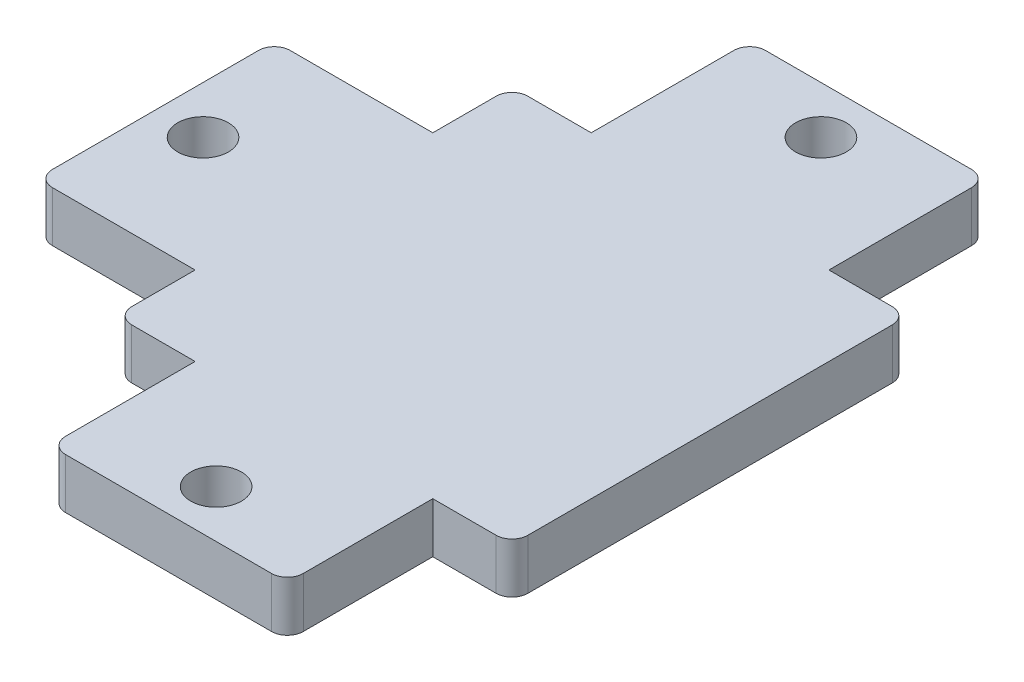
ISO-10303-21;
HEADER;
FILE_DESCRIPTION(('STEP AP214'),'2;1');
FILE_NAME('part.step','',(''),(''),'','','');
FILE_SCHEMA(('AUTOMOTIVE_DESIGN { 1 0 10303 214 1 1 1 1 }'));
ENDSEC;
DATA;
#1=APPLICATION_CONTEXT('core data for automotive mechanical design processes');
#2=APPLICATION_PROTOCOL_DEFINITION('international standard','automotive_design',2000,#1);
#3=PRODUCT_CONTEXT('',#1,'mechanical');
#4=PRODUCT('Part','Part','',(#3));
#5=PRODUCT_RELATED_PRODUCT_CATEGORY('part','',(#4));
#6=PRODUCT_DEFINITION_FORMATION('','',#4);
#7=PRODUCT_DEFINITION_CONTEXT('part definition',#1,'design');
#8=PRODUCT_DEFINITION('design','',#6,#7);
#9=PRODUCT_DEFINITION_SHAPE('','',#8);
#10=(LENGTH_UNIT() NAMED_UNIT(*) SI_UNIT(.MILLI.,.METRE.));
#11=(NAMED_UNIT(*) PLANE_ANGLE_UNIT() SI_UNIT($,.RADIAN.));
#12=(NAMED_UNIT(*) SI_UNIT($,.STERADIAN.) SOLID_ANGLE_UNIT());
#13=UNCERTAINTY_MEASURE_WITH_UNIT(LENGTH_MEASURE(1.E-05),#10,'distance_accuracy_value','');
#14=(GEOMETRIC_REPRESENTATION_CONTEXT(3) GLOBAL_UNCERTAINTY_ASSIGNED_CONTEXT((#13)) GLOBAL_UNIT_ASSIGNED_CONTEXT((#10,
#11,#12)) REPRESENTATION_CONTEXT('',''));
#15=CARTESIAN_POINT('',(0.,0.,0.));
#16=DIRECTION('',(0.,0.,1.));
#17=DIRECTION('',(1.,0.,0.));
#18=AXIS2_PLACEMENT_3D('',#15,#16,#17);
#19=CARTESIAN_POINT('',(-10.,-6.825,15.));
#20=DIRECTION('',(0.,0.,-1.));
#21=DIRECTION('',(-1.,0.,0.));
#22=AXIS2_PLACEMENT_3D('',#19,#20,#21);
#23=PLANE('',#22);
#24=DIRECTION('',(-1.,0.,0.));
#25=VECTOR('',#24,1.);
#26=CARTESIAN_POINT('',(-10.,3.175,15.));
#27=LINE('',#26,#25);
#28=CARTESIAN_POINT('',(-4.99999999999999,3.175,15.));
#29=VERTEX_POINT('',#28);
#30=CARTESIAN_POINT('',(-9.,3.175,15.));
#31=VERTEX_POINT('',#30);
#32=EDGE_CURVE('E330',#29,#31,#27,.T.);
#33=ORIENTED_EDGE('',*,*,#32,.T.);
#34=DIRECTION('',(0.,1.,0.));
#35=VECTOR('',#34,1.);
#36=CARTESIAN_POINT('',(-9.,-6.825,15.));
#37=LINE('',#36,#35);
#38=CARTESIAN_POINT('',(-9.,0.,15.));
#39=VERTEX_POINT('',#38);
#40=EDGE_CURVE('E408',#31,#39,#37,.F.);
#41=ORIENTED_EDGE('',*,*,#40,.T.);
#42=DIRECTION('',(1.,0.,0.));
#43=VECTOR('',#42,1.);
#44=CARTESIAN_POINT('',(0.,0.,15.));
#45=LINE('',#44,#43);
#46=CARTESIAN_POINT('',(-4.99999999999999,0.,15.));
#47=VERTEX_POINT('',#46);
#48=EDGE_CURVE('E474',#39,#47,#45,.T.);
#49=ORIENTED_EDGE('',*,*,#48,.T.);
#50=DIRECTION('',(0.,1.,0.));
#51=VECTOR('',#50,1.);
#52=CARTESIAN_POINT('',(-4.99999999999999,-6.825,15.));
#53=LINE('',#52,#51);
#54=EDGE_CURVE('E335',#47,#29,#53,.T.);
#55=ORIENTED_EDGE('',*,*,#54,.T.);
#56=EDGE_LOOP('',(#33,#41,#49,#55));
#57=FACE_BOUND('',#56,.T.);
#58=ADVANCED_FACE('F130',(#57),#23,.F.);
#59=CARTESIAN_POINT('',(-20.,3.175,-20.));
#60=DIRECTION('',(1.,0.,0.));
#61=DIRECTION('',(0.,0.,-1.));
#62=AXIS2_PLACEMENT_3D('',#59,#60,#61);
#63=PLANE('',#62);
#64=DIRECTION('',(0.,0.,1.));
#65=VECTOR('',#64,1.);
#66=CARTESIAN_POINT('',(-20.,0.,-20.));
#67=LINE('',#66,#65);
#68=CARTESIAN_POINT('',(-20.,0.,-4.));
#69=VERTEX_POINT('',#68);
#70=CARTESIAN_POINT('',(-20.,0.,9.00000000000001));
#71=VERTEX_POINT('',#70);
#72=EDGE_CURVE('E462',#69,#71,#67,.T.);
#73=ORIENTED_EDGE('',*,*,#72,.T.);
#74=DIRECTION('',(0.,1.,0.));
#75=VECTOR('',#74,1.);
#76=CARTESIAN_POINT('',(-20.,3.175,9.00000000000001));
#77=LINE('',#76,#75);
#78=CARTESIAN_POINT('',(-20.,3.175,9.00000000000001));
#79=VERTEX_POINT('',#78);
#80=EDGE_CURVE('E412',#71,#79,#77,.T.);
#81=ORIENTED_EDGE('',*,*,#80,.T.);
#82=DIRECTION('',(0.,0.,1.));
#83=VECTOR('',#82,1.);
#84=CARTESIAN_POINT('',(-20.,3.175,-20.));
#85=LINE('',#84,#83);
#86=CARTESIAN_POINT('',(-20.,3.175,-4.));
#87=VERTEX_POINT('',#86);
#88=EDGE_CURVE('E455',#87,#79,#85,.T.);
#89=ORIENTED_EDGE('',*,*,#88,.F.);
#90=DIRECTION('',(0.,1.,0.));
#91=VECTOR('',#90,1.);
#92=CARTESIAN_POINT('',(-20.,3.175,-4.));
#93=LINE('',#92,#91);
#94=EDGE_CURVE('E410',#87,#69,#93,.F.);
#95=ORIENTED_EDGE('',*,*,#94,.T.);
#96=EDGE_LOOP('',(#73,#81,#89,#95));
#97=FACE_BOUND('',#96,.T.);
#98=ADVANCED_FACE('F556',(#97),#63,.F.);
#99=CARTESIAN_POINT('',(20.,3.175,-20.));
#100=DIRECTION('',(0.,0.,1.));
#101=DIRECTION('',(1.,0.,0.));
#102=AXIS2_PLACEMENT_3D('',#99,#100,#101);
#103=PLANE('',#102);
#104=DIRECTION('',(-1.,0.,0.));
#105=VECTOR('',#104,1.);
#106=CARTESIAN_POINT('',(20.,0.,-20.));
#107=LINE('',#106,#105);
#108=CARTESIAN_POINT('',(9.00000000000001,0.,-20.));
#109=VERTEX_POINT('',#108);
#110=CARTESIAN_POINT('',(-4.,0.,-20.));
#111=VERTEX_POINT('',#110);
#112=EDGE_CURVE('E453',#109,#111,#107,.T.);
#113=ORIENTED_EDGE('',*,*,#112,.T.);
#114=DIRECTION('',(0.,1.,0.));
#115=VECTOR('',#114,1.);
#116=CARTESIAN_POINT('',(-4.,3.175,-20.));
#117=LINE('',#116,#115);
#118=CARTESIAN_POINT('',(-4.,3.175,-20.));
#119=VERTEX_POINT('',#118);
#120=EDGE_CURVE('E422',#111,#119,#117,.T.);
#121=ORIENTED_EDGE('',*,*,#120,.T.);
#122=DIRECTION('',(-1.,0.,0.));
#123=VECTOR('',#122,1.);
#124=CARTESIAN_POINT('',(20.,3.175,-20.));
#125=LINE('',#124,#123);
#126=CARTESIAN_POINT('',(9.00000000000001,3.175,-20.));
#127=VERTEX_POINT('',#126);
#128=EDGE_CURVE('E451',#127,#119,#125,.T.);
#129=ORIENTED_EDGE('',*,*,#128,.F.);
#130=DIRECTION('',(0.,1.,0.));
#131=VECTOR('',#130,1.);
#132=CARTESIAN_POINT('',(9.00000000000001,3.175,-20.));
#133=LINE('',#132,#131);
#134=EDGE_CURVE('E420',#127,#109,#133,.F.);
#135=ORIENTED_EDGE('',*,*,#134,.T.);
#136=EDGE_LOOP('',(#113,#121,#129,#135));
#137=FACE_BOUND('',#136,.T.);
#138=ADVANCED_FACE('F450',(#137),#103,.F.);
#139=CARTESIAN_POINT('',(0.,3.175,0.));
#140=DIRECTION('',(0.,-1.,0.));
#141=DIRECTION('',(0.,0.,-1.));
#142=AXIS2_PLACEMENT_3D('',#139,#140,#141);
#143=PLANE('',#142);
#144=CARTESIAN_POINT('',(2.50000000000001,3.175,21.175));
#145=DIRECTION('',(0.,1.,0.));
#146=DIRECTION('',(0.,0.,1.));
#147=AXIS2_PLACEMENT_3D('',#144,#145,#146);
#148=CIRCLE('',#147,1.6);
#149=CARTESIAN_POINT('',(2.50000000000001,3.175,22.775));
#150=VERTEX_POINT('',#149);
#151=EDGE_CURVE('E626',#150,#150,#148,.T.);
#152=ORIENTED_EDGE('',*,*,#151,.F.);
#153=EDGE_LOOP('',(#152));
#154=FACE_BOUND('',#153,.T.);
#155=DIRECTION('',(0.,0.,1.));
#156=VECTOR('',#155,1.);
#157=CARTESIAN_POINT('',(-5.,3.175,-10.));
#158=LINE('',#157,#156);
#159=CARTESIAN_POINT('',(-4.99999999999999,3.175,23.175));
#160=VERTEX_POINT('',#159);
#161=EDGE_CURVE('E317',#29,#160,#158,.T.);
#162=ORIENTED_EDGE('',*,*,#161,.T.);
#163=CARTESIAN_POINT('',(-3.99999999999999,3.175,23.175));
#164=DIRECTION('',(0.,-1.,0.));
#165=DIRECTION('',(0.,0.,-1.));
#166=AXIS2_PLACEMENT_3D('',#163,#164,#165);
#167=CIRCLE('',#166,1.);
#168=CARTESIAN_POINT('',(-3.99999999999999,3.175,24.175));
#169=VERTEX_POINT('',#168);
#170=EDGE_CURVE('E365',#160,#169,#167,.F.);
#171=ORIENTED_EDGE('',*,*,#170,.T.);
#172=DIRECTION('',(1.,0.,0.));
#173=VECTOR('',#172,1.);
#174=CARTESIAN_POINT('',(10.,3.175,24.175));
#175=LINE('',#174,#173);
#176=CARTESIAN_POINT('',(9.00000000000001,3.175,24.175));
#177=VERTEX_POINT('',#176);
#178=EDGE_CURVE('E633',#169,#177,#175,.T.);
#179=ORIENTED_EDGE('',*,*,#178,.T.);
#180=CARTESIAN_POINT('',(9.00000000000001,3.175,23.175));
#181=DIRECTION('',(0.,-1.,0.));
#182=DIRECTION('',(0.,0.,-1.));
#183=AXIS2_PLACEMENT_3D('',#180,#181,#182);
#184=CIRCLE('',#183,1.);
#185=CARTESIAN_POINT('',(10.,3.175,23.175));
#186=VERTEX_POINT('',#185);
#187=EDGE_CURVE('E313',#177,#186,#184,.F.);
#188=ORIENTED_EDGE('',*,*,#187,.T.);
#189=DIRECTION('',(0.,0.,-1.));
#190=VECTOR('',#189,1.);
#191=CARTESIAN_POINT('',(10.,3.175,-10.));
#192=LINE('',#191,#190);
#193=CARTESIAN_POINT('',(10.,3.175,15.));
#194=VERTEX_POINT('',#193);
#195=EDGE_CURVE('E306',#186,#194,#192,.T.);
#196=ORIENTED_EDGE('',*,*,#195,.T.);
#197=CARTESIAN_POINT('',(14.,3.175,15.));
#198=VERTEX_POINT('',#197);
#199=EDGE_CURVE('E311',#198,#194,#27,.T.);
#200=ORIENTED_EDGE('',*,*,#199,.F.);
#201=CARTESIAN_POINT('',(14.,3.175,14.));
#202=DIRECTION('',(0.,-1.,0.));
#203=DIRECTION('',(0.,0.,-1.));
#204=AXIS2_PLACEMENT_3D('',#201,#202,#203);
#205=CIRCLE('',#204,1.);
#206=CARTESIAN_POINT('',(15.,3.175,14.));
#207=VERTEX_POINT('',#206);
#208=EDGE_CURVE('E362',#198,#207,#205,.F.);
#209=ORIENTED_EDGE('',*,*,#208,.T.);
#210=DIRECTION('',(0.,0.,1.));
#211=VECTOR('',#210,1.);
#212=CARTESIAN_POINT('',(15.,3.175,-10.));
#213=LINE('',#212,#211);
#214=CARTESIAN_POINT('',(15.,3.175,-9.));
#215=VERTEX_POINT('',#214);
#216=EDGE_CURVE('E615',#215,#207,#213,.T.);
#217=ORIENTED_EDGE('',*,*,#216,.F.);
#218=CARTESIAN_POINT('',(14.,3.175,-9.));
#219=DIRECTION('',(0.,-1.,0.));
#220=DIRECTION('',(0.,0.,-1.));
#221=AXIS2_PLACEMENT_3D('',#218,#219,#220);
#222=CIRCLE('',#221,1.);
#223=CARTESIAN_POINT('',(14.,3.175,-10.));
#224=VERTEX_POINT('',#223);
#225=EDGE_CURVE('E360',#215,#224,#222,.F.);
#226=ORIENTED_EDGE('',*,*,#225,.T.);
#227=DIRECTION('',(1.,0.,0.));
#228=VECTOR('',#227,1.);
#229=CARTESIAN_POINT('',(20.,3.175,-10.));
#230=LINE('',#229,#228);
#231=CARTESIAN_POINT('',(10.,3.175,-10.));
#232=VERTEX_POINT('',#231);
#233=EDGE_CURVE('E524',#232,#224,#230,.T.);
#234=ORIENTED_EDGE('',*,*,#233,.F.);
#235=DIRECTION('',(0.,0.,1.));
#236=VECTOR('',#235,1.);
#237=CARTESIAN_POINT('',(10.,3.175,-10.));
#238=LINE('',#237,#236);
#239=CARTESIAN_POINT('',(10.,3.175,-19.));
#240=VERTEX_POINT('',#239);
#241=EDGE_CURVE('E520',#240,#232,#238,.T.);
#242=ORIENTED_EDGE('',*,*,#241,.F.);
#243=CARTESIAN_POINT('',(9.00000000000001,3.175,-19.));
#244=DIRECTION('',(0.,-1.,0.));
#245=DIRECTION('',(0.,0.,-1.));
#246=AXIS2_PLACEMENT_3D('',#243,#244,#245);
#247=CIRCLE('',#246,1.);
#248=EDGE_CURVE('E348',#240,#127,#247,.F.);
#249=ORIENTED_EDGE('',*,*,#248,.T.);
#250=ORIENTED_EDGE('',*,*,#128,.T.);
#251=CARTESIAN_POINT('',(-4.,3.175,-19.));
#252=DIRECTION('',(0.,-1.,0.));
#253=DIRECTION('',(0.,0.,-1.));
#254=AXIS2_PLACEMENT_3D('',#251,#252,#253);
#255=CIRCLE('',#254,1.);
#256=CARTESIAN_POINT('',(-5.,3.175,-19.));
#257=VERTEX_POINT('',#256);
#258=EDGE_CURVE('E350',#119,#257,#255,.F.);
#259=ORIENTED_EDGE('',*,*,#258,.T.);
#260=DIRECTION('',(0.,0.,-1.));
#261=VECTOR('',#260,1.);
#262=CARTESIAN_POINT('',(-5.,3.175,-10.));
#263=LINE('',#262,#261);
#264=CARTESIAN_POINT('',(-5.,3.175,-10.));
#265=VERTEX_POINT('',#264);
#266=EDGE_CURVE('E433',#265,#257,#263,.T.);
#267=ORIENTED_EDGE('',*,*,#266,.F.);
#268=DIRECTION('',(1.,0.,0.));
#269=VECTOR('',#268,1.);
#270=CARTESIAN_POINT('',(-20.,3.175,-10.));
#271=LINE('',#270,#269);
#272=CARTESIAN_POINT('',(-9.,3.175,-10.));
#273=VERTEX_POINT('',#272);
#274=EDGE_CURVE('E529',#273,#265,#271,.T.);
#275=ORIENTED_EDGE('',*,*,#274,.F.);
#276=CARTESIAN_POINT('',(-9.,3.175,-9.00000000000001));
#277=DIRECTION('',(0.,-1.,0.));
#278=DIRECTION('',(0.,0.,-1.));
#279=AXIS2_PLACEMENT_3D('',#276,#277,#278);
#280=CIRCLE('',#279,1.);
#281=CARTESIAN_POINT('',(-10.,3.175,-9.00000000000001));
#282=VERTEX_POINT('',#281);
#283=EDGE_CURVE('E358',#273,#282,#280,.F.);
#284=ORIENTED_EDGE('',*,*,#283,.T.);
#285=DIRECTION('',(0.,0.,-1.));
#286=VECTOR('',#285,1.);
#287=CARTESIAN_POINT('',(-10.,3.175,-10.));
#288=LINE('',#287,#286);
#289=CARTESIAN_POINT('',(-10.,3.175,-5.));
#290=VERTEX_POINT('',#289);
#291=EDGE_CURVE('E506',#290,#282,#288,.T.);
#292=ORIENTED_EDGE('',*,*,#291,.F.);
#293=DIRECTION('',(1.,0.,0.));
#294=VECTOR('',#293,1.);
#295=CARTESIAN_POINT('',(-20.,3.175,-5.));
#296=LINE('',#295,#294);
#297=CARTESIAN_POINT('',(-19.,3.175,-5.));
#298=VERTEX_POINT('',#297);
#299=EDGE_CURVE('E509',#298,#290,#296,.T.);
#300=ORIENTED_EDGE('',*,*,#299,.F.);
#301=CARTESIAN_POINT('',(-19.,3.175,-4.));
#302=DIRECTION('',(0.,-1.,0.));
#303=DIRECTION('',(0.,0.,-1.));
#304=AXIS2_PLACEMENT_3D('',#301,#302,#303);
#305=CIRCLE('',#304,1.);
#306=EDGE_CURVE('E352',#298,#87,#305,.F.);
#307=ORIENTED_EDGE('',*,*,#306,.T.);
#308=ORIENTED_EDGE('',*,*,#88,.T.);
#309=CARTESIAN_POINT('',(-19.,3.175,9.00000000000001));
#310=DIRECTION('',(0.,-1.,0.));
#311=DIRECTION('',(0.,0.,-1.));
#312=AXIS2_PLACEMENT_3D('',#309,#310,#311);
#313=CIRCLE('',#312,1.);
#314=CARTESIAN_POINT('',(-19.,3.175,10.));
#315=VERTEX_POINT('',#314);
#316=EDGE_CURVE('E354',#79,#315,#313,.F.);
#317=ORIENTED_EDGE('',*,*,#316,.T.);
#318=DIRECTION('',(-1.,0.,0.));
#319=VECTOR('',#318,1.);
#320=CARTESIAN_POINT('',(-10.,3.175,10.));
#321=LINE('',#320,#319);
#322=CARTESIAN_POINT('',(-10.,3.175,10.));
#323=VERTEX_POINT('',#322);
#324=EDGE_CURVE('E502',#323,#315,#321,.T.);
#325=ORIENTED_EDGE('',*,*,#324,.F.);
#326=DIRECTION('',(0.,0.,-1.));
#327=VECTOR('',#326,1.);
#328=CARTESIAN_POINT('',(-10.,3.175,15.));
#329=LINE('',#328,#327);
#330=CARTESIAN_POINT('',(-10.,3.175,14.));
#331=VERTEX_POINT('',#330);
#332=EDGE_CURVE('E329',#331,#323,#329,.T.);
#333=ORIENTED_EDGE('',*,*,#332,.F.);
#334=CARTESIAN_POINT('',(-9.,3.175,14.));
#335=DIRECTION('',(0.,-1.,0.));
#336=DIRECTION('',(0.,0.,-1.));
#337=AXIS2_PLACEMENT_3D('',#334,#335,#336);
#338=CIRCLE('',#337,1.);
#339=EDGE_CURVE('E356',#331,#31,#338,.F.);
#340=ORIENTED_EDGE('',*,*,#339,.T.);
#341=ORIENTED_EDGE('',*,*,#32,.F.);
#342=EDGE_LOOP('',(#162,#171,#179,#188,#196,#200,#209,#217,#226,#234,#242,#249,#250,#259,#267,
#275,#284,#292,#300,#307,#308,#317,#325,#333,#340,#341));
#343=FACE_BOUND('',#342,.T.);
#344=CARTESIAN_POINT('',(-17.,3.175,2.5));
#345=DIRECTION('',(0.,1.,0.));
#346=DIRECTION('',(0.,0.,1.));
#347=AXIS2_PLACEMENT_3D('',#344,#345,#346);
#348=CIRCLE('',#347,1.6);
#349=CARTESIAN_POINT('',(-17.,3.175,4.1));
#350=VERTEX_POINT('',#349);
#351=EDGE_CURVE('E497',#350,#350,#348,.T.);
#352=ORIENTED_EDGE('',*,*,#351,.F.);
#353=EDGE_LOOP('',(#352));
#354=FACE_BOUND('',#353,.T.);
#355=CARTESIAN_POINT('',(2.5,3.175,-17.));
#356=DIRECTION('',(0.,1.,0.));
#357=DIRECTION('',(0.,0.,1.));
#358=AXIS2_PLACEMENT_3D('',#355,#356,#357);
#359=CIRCLE('',#358,1.6);
#360=CARTESIAN_POINT('',(2.5,3.175,-15.4));
#361=VERTEX_POINT('',#360);
#362=EDGE_CURVE('E516',#361,#361,#359,.T.);
#363=ORIENTED_EDGE('',*,*,#362,.F.);
#364=EDGE_LOOP('',(#363));
#365=FACE_BOUND('',#364,.T.);
#366=ADVANCED_FACE('F309',(#154,#343,#354,#365),#143,.F.);
#367=CARTESIAN_POINT('',(0.,0.,0.));
#368=DIRECTION('',(0.,-1.,0.));
#369=DIRECTION('',(0.,0.,-1.));
#370=AXIS2_PLACEMENT_3D('',#367,#368,#369);
#371=PLANE('',#370);
#372=DIRECTION('',(1.,0.,0.));
#373=VECTOR('',#372,1.);
#374=CARTESIAN_POINT('',(10.,0.,24.175));
#375=LINE('',#374,#373);
#376=CARTESIAN_POINT('',(-3.99999999999999,0.,24.175));
#377=VERTEX_POINT('',#376);
#378=CARTESIAN_POINT('',(9.00000000000001,0.,24.175));
#379=VERTEX_POINT('',#378);
#380=EDGE_CURVE('E638',#377,#379,#375,.T.);
#381=ORIENTED_EDGE('',*,*,#380,.F.);
#382=CARTESIAN_POINT('',(-3.99999999999999,0.,23.175));
#383=DIRECTION('',(0.,-1.,0.));
#384=DIRECTION('',(0.,0.,-1.));
#385=AXIS2_PLACEMENT_3D('',#382,#383,#384);
#386=CIRCLE('',#385,1.);
#387=CARTESIAN_POINT('',(-4.99999999999999,0.,23.175));
#388=VERTEX_POINT('',#387);
#389=EDGE_CURVE('E389',#377,#388,#386,.T.);
#390=ORIENTED_EDGE('',*,*,#389,.T.);
#391=DIRECTION('',(0.,0.,1.));
#392=VECTOR('',#391,1.);
#393=CARTESIAN_POINT('',(-5.,0.,-10.));
#394=LINE('',#393,#392);
#395=EDGE_CURVE('E635',#47,#388,#394,.T.);
#396=ORIENTED_EDGE('',*,*,#395,.F.);
#397=ORIENTED_EDGE('',*,*,#48,.F.);
#398=CARTESIAN_POINT('',(-9.,0.,14.));
#399=DIRECTION('',(0.,-1.,0.));
#400=DIRECTION('',(0.,0.,-1.));
#401=AXIS2_PLACEMENT_3D('',#398,#399,#400);
#402=CIRCLE('',#401,1.);
#403=CARTESIAN_POINT('',(-10.,0.,14.));
#404=VERTEX_POINT('',#403);
#405=EDGE_CURVE('E379',#39,#404,#402,.T.);
#406=ORIENTED_EDGE('',*,*,#405,.T.);
#407=DIRECTION('',(0.,0.,1.));
#408=VECTOR('',#407,1.);
#409=CARTESIAN_POINT('',(-10.,0.,0.));
#410=LINE('',#409,#408);
#411=CARTESIAN_POINT('',(-10.,0.,10.));
#412=VERTEX_POINT('',#411);
#413=EDGE_CURVE('E341',#412,#404,#410,.T.);
#414=ORIENTED_EDGE('',*,*,#413,.F.);
#415=DIRECTION('',(1.,0.,0.));
#416=VECTOR('',#415,1.);
#417=CARTESIAN_POINT('',(0.,0.,10.));
#418=LINE('',#417,#416);
#419=CARTESIAN_POINT('',(-19.,0.,10.));
#420=VERTEX_POINT('',#419);
#421=EDGE_CURVE('E336',#420,#412,#418,.T.);
#422=ORIENTED_EDGE('',*,*,#421,.F.);
#423=CARTESIAN_POINT('',(-19.,0.,9.00000000000001));
#424=DIRECTION('',(0.,-1.,0.));
#425=DIRECTION('',(0.,0.,-1.));
#426=AXIS2_PLACEMENT_3D('',#423,#424,#425);
#427=CIRCLE('',#426,1.);
#428=EDGE_CURVE('E377',#420,#71,#427,.T.);
#429=ORIENTED_EDGE('',*,*,#428,.T.);
#430=ORIENTED_EDGE('',*,*,#72,.F.);
#431=CARTESIAN_POINT('',(-19.,0.,-4.));
#432=DIRECTION('',(0.,-1.,0.));
#433=DIRECTION('',(0.,0.,-1.));
#434=AXIS2_PLACEMENT_3D('',#431,#432,#433);
#435=CIRCLE('',#434,1.);
#436=CARTESIAN_POINT('',(-19.,0.,-5.));
#437=VERTEX_POINT('',#436);
#438=EDGE_CURVE('E375',#69,#437,#435,.T.);
#439=ORIENTED_EDGE('',*,*,#438,.T.);
#440=DIRECTION('',(-1.,0.,0.));
#441=VECTOR('',#440,1.);
#442=CARTESIAN_POINT('',(0.,0.,-5.));
#443=LINE('',#442,#441);
#444=CARTESIAN_POINT('',(-10.,0.,-5.));
#445=VERTEX_POINT('',#444);
#446=EDGE_CURVE('E470',#445,#437,#443,.T.);
#447=ORIENTED_EDGE('',*,*,#446,.F.);
#448=DIRECTION('',(0.,0.,1.));
#449=VECTOR('',#448,1.);
#450=CARTESIAN_POINT('',(-10.,0.,0.));
#451=LINE('',#450,#449);
#452=CARTESIAN_POINT('',(-10.,0.,-9.00000000000001));
#453=VERTEX_POINT('',#452);
#454=EDGE_CURVE('E514',#453,#445,#451,.T.);
#455=ORIENTED_EDGE('',*,*,#454,.F.);
#456=CARTESIAN_POINT('',(-9.,0.,-9.00000000000001));
#457=DIRECTION('',(0.,-1.,0.));
#458=DIRECTION('',(0.,0.,-1.));
#459=AXIS2_PLACEMENT_3D('',#456,#457,#458);
#460=CIRCLE('',#459,1.);
#461=CARTESIAN_POINT('',(-9.,0.,-10.));
#462=VERTEX_POINT('',#461);
#463=EDGE_CURVE('E381',#453,#462,#460,.T.);
#464=ORIENTED_EDGE('',*,*,#463,.T.);
#465=DIRECTION('',(-1.,0.,0.));
#466=VECTOR('',#465,1.);
#467=CARTESIAN_POINT('',(0.,0.,-10.));
#468=LINE('',#467,#466);
#469=CARTESIAN_POINT('',(-5.,0.,-10.));
#470=VERTEX_POINT('',#469);
#471=EDGE_CURVE('E442',#470,#462,#468,.T.);
#472=ORIENTED_EDGE('',*,*,#471,.F.);
#473=DIRECTION('',(0.,0.,1.));
#474=VECTOR('',#473,1.);
#475=CARTESIAN_POINT('',(-5.,0.,0.));
#476=LINE('',#475,#474);
#477=CARTESIAN_POINT('',(-5.,0.,-19.));
#478=VERTEX_POINT('',#477);
#479=EDGE_CURVE('E430',#478,#470,#476,.T.);
#480=ORIENTED_EDGE('',*,*,#479,.F.);
#481=CARTESIAN_POINT('',(-4.,0.,-19.));
#482=DIRECTION('',(0.,-1.,0.));
#483=DIRECTION('',(0.,0.,-1.));
#484=AXIS2_PLACEMENT_3D('',#481,#482,#483);
#485=CIRCLE('',#484,1.);
#486=EDGE_CURVE('E373',#478,#111,#485,.T.);
#487=ORIENTED_EDGE('',*,*,#486,.T.);
#488=ORIENTED_EDGE('',*,*,#112,.F.);
#489=CARTESIAN_POINT('',(9.00000000000001,0.,-19.));
#490=DIRECTION('',(0.,-1.,0.));
#491=DIRECTION('',(0.,0.,-1.));
#492=AXIS2_PLACEMENT_3D('',#489,#490,#491);
#493=CIRCLE('',#492,1.);
#494=CARTESIAN_POINT('',(10.,0.,-19.));
#495=VERTEX_POINT('',#494);
#496=EDGE_CURVE('E153',#109,#495,#493,.T.);
#497=ORIENTED_EDGE('',*,*,#496,.T.);
#498=DIRECTION('',(0.,0.,-1.));
#499=VECTOR('',#498,1.);
#500=CARTESIAN_POINT('',(10.,0.,0.));
#501=LINE('',#500,#499);
#502=CARTESIAN_POINT('',(10.,0.,-10.));
#503=VERTEX_POINT('',#502);
#504=EDGE_CURVE('E443',#503,#495,#501,.T.);
#505=ORIENTED_EDGE('',*,*,#504,.F.);
#506=DIRECTION('',(-1.,0.,0.));
#507=VECTOR('',#506,1.);
#508=CARTESIAN_POINT('',(0.,0.,-10.));
#509=LINE('',#508,#507);
#510=CARTESIAN_POINT('',(14.,0.,-10.));
#511=VERTEX_POINT('',#510);
#512=EDGE_CURVE('E468',#511,#503,#509,.T.);
#513=ORIENTED_EDGE('',*,*,#512,.F.);
#514=CARTESIAN_POINT('',(14.,0.,-9.));
#515=DIRECTION('',(0.,-1.,0.));
#516=DIRECTION('',(0.,0.,-1.));
#517=AXIS2_PLACEMENT_3D('',#514,#515,#516);
#518=CIRCLE('',#517,1.);
#519=CARTESIAN_POINT('',(15.,0.,-9.));
#520=VERTEX_POINT('',#519);
#521=EDGE_CURVE('E383',#511,#520,#518,.T.);
#522=ORIENTED_EDGE('',*,*,#521,.T.);
#523=DIRECTION('',(0.,0.,-1.));
#524=VECTOR('',#523,1.);
#525=CARTESIAN_POINT('',(15.,0.,0.));
#526=LINE('',#525,#524);
#527=CARTESIAN_POINT('',(15.,0.,14.));
#528=VERTEX_POINT('',#527);
#529=EDGE_CURVE('E620',#528,#520,#526,.T.);
#530=ORIENTED_EDGE('',*,*,#529,.F.);
#531=CARTESIAN_POINT('',(14.,0.,14.));
#532=DIRECTION('',(0.,-1.,0.));
#533=DIRECTION('',(0.,0.,-1.));
#534=AXIS2_PLACEMENT_3D('',#531,#532,#533);
#535=CIRCLE('',#534,1.);
#536=CARTESIAN_POINT('',(14.,0.,15.));
#537=VERTEX_POINT('',#536);
#538=EDGE_CURVE('E385',#528,#537,#535,.T.);
#539=ORIENTED_EDGE('',*,*,#538,.T.);
#540=CARTESIAN_POINT('',(10.,0.,15.));
#541=VERTEX_POINT('',#540);
#542=EDGE_CURVE('E473',#541,#537,#45,.T.);
#543=ORIENTED_EDGE('',*,*,#542,.F.);
#544=DIRECTION('',(0.,0.,-1.));
#545=VECTOR('',#544,1.);
#546=CARTESIAN_POINT('',(10.,0.,-10.));
#547=LINE('',#546,#545);
#548=CARTESIAN_POINT('',(10.,0.,23.175));
#549=VERTEX_POINT('',#548);
#550=EDGE_CURVE('E334',#549,#541,#547,.T.);
#551=ORIENTED_EDGE('',*,*,#550,.F.);
#552=CARTESIAN_POINT('',(9.00000000000001,0.,23.175));
#553=DIRECTION('',(0.,-1.,0.));
#554=DIRECTION('',(0.,0.,-1.));
#555=AXIS2_PLACEMENT_3D('',#552,#553,#554);
#556=CIRCLE('',#555,1.);
#557=EDGE_CURVE('E387',#549,#379,#556,.T.);
#558=ORIENTED_EDGE('',*,*,#557,.T.);
#559=EDGE_LOOP('',(#381,#390,#396,#397,#406,#414,#422,#429,#430,#439,#447,#455,#464,#472,#480,
#487,#488,#497,#505,#513,#522,#530,#539,#543,#551,#558));
#560=FACE_BOUND('',#559,.T.);
#561=CARTESIAN_POINT('',(2.50000000000001,0.,21.175));
#562=DIRECTION('',(0.,1.,0.));
#563=DIRECTION('',(0.,0.,1.));
#564=AXIS2_PLACEMENT_3D('',#561,#562,#563);
#565=CIRCLE('',#564,1.6);
#566=CARTESIAN_POINT('',(2.50000000000001,0.,22.775));
#567=VERTEX_POINT('',#566);
#568=EDGE_CURVE('E318',#567,#567,#565,.T.);
#569=ORIENTED_EDGE('',*,*,#568,.T.);
#570=EDGE_LOOP('',(#569));
#571=FACE_BOUND('',#570,.T.);
#572=CARTESIAN_POINT('',(-17.,0.,2.5));
#573=DIRECTION('',(0.,-1.,0.));
#574=DIRECTION('',(0.,0.,-1.));
#575=AXIS2_PLACEMENT_3D('',#572,#573,#574);
#576=CIRCLE('',#575,1.6);
#577=CARTESIAN_POINT('',(-17.,0.,0.9));
#578=VERTEX_POINT('',#577);
#579=EDGE_CURVE('E344',#578,#578,#576,.T.);
#580=ORIENTED_EDGE('',*,*,#579,.F.);
#581=EDGE_LOOP('',(#580));
#582=FACE_BOUND('',#581,.T.);
#583=CARTESIAN_POINT('',(2.5,0.,-17.));
#584=DIRECTION('',(0.,1.,0.));
#585=DIRECTION('',(0.,0.,1.));
#586=AXIS2_PLACEMENT_3D('',#583,#584,#585);
#587=CIRCLE('',#586,1.6);
#588=CARTESIAN_POINT('',(2.5,0.,-15.4));
#589=VERTEX_POINT('',#588);
#590=EDGE_CURVE('E517',#589,#589,#587,.T.);
#591=ORIENTED_EDGE('',*,*,#590,.T.);
#592=EDGE_LOOP('',(#591));
#593=FACE_BOUND('',#592,.T.);
#594=ADVANCED_FACE('F438',(#560,#571,#582,#593),#371,.T.);
#595=CARTESIAN_POINT('',(-5.,-6.825,-10.));
#596=DIRECTION('',(1.,0.,0.));
#597=DIRECTION('',(0.,0.,-1.));
#598=AXIS2_PLACEMENT_3D('',#595,#596,#597);
#599=PLANE('',#598);
#600=ORIENTED_EDGE('',*,*,#266,.T.);
#601=DIRECTION('',(0.,1.,0.));
#602=VECTOR('',#601,1.);
#603=CARTESIAN_POINT('',(-5.,-6.825,-19.));
#604=LINE('',#603,#602);
#605=EDGE_CURVE('E138',#257,#478,#604,.F.);
#606=ORIENTED_EDGE('',*,*,#605,.T.);
#607=ORIENTED_EDGE('',*,*,#479,.T.);
#608=DIRECTION('',(0.,1.,0.));
#609=VECTOR('',#608,1.);
#610=CARTESIAN_POINT('',(-5.,-6.825,-10.));
#611=LINE('',#610,#609);
#612=EDGE_CURVE('E465',#470,#265,#611,.T.);
#613=ORIENTED_EDGE('',*,*,#612,.T.);
#614=EDGE_LOOP('',(#600,#606,#607,#613));
#615=FACE_BOUND('',#614,.T.);
#616=ADVANCED_FACE('F428',(#615),#599,.F.);
#617=CARTESIAN_POINT('',(-20.,-6.825,-10.));
#618=DIRECTION('',(0.,0.,1.));
#619=DIRECTION('',(1.,0.,0.));
#620=AXIS2_PLACEMENT_3D('',#617,#618,#619);
#621=PLANE('',#620);
#622=ORIENTED_EDGE('',*,*,#471,.T.);
#623=DIRECTION('',(0.,1.,0.));
#624=VECTOR('',#623,1.);
#625=CARTESIAN_POINT('',(-9.,-6.825,-10.));
#626=LINE('',#625,#624);
#627=EDGE_CURVE('E400',#462,#273,#626,.T.);
#628=ORIENTED_EDGE('',*,*,#627,.T.);
#629=ORIENTED_EDGE('',*,*,#274,.T.);
#630=ORIENTED_EDGE('',*,*,#612,.F.);
#631=EDGE_LOOP('',(#622,#628,#629,#630));
#632=FACE_BOUND('',#631,.T.);
#633=ADVANCED_FACE('F534',(#632),#621,.F.);
#634=CARTESIAN_POINT('',(20.,-6.825,-10.));
#635=DIRECTION('',(0.,0.,1.));
#636=DIRECTION('',(1.,0.,0.));
#637=AXIS2_PLACEMENT_3D('',#634,#635,#636);
#638=PLANE('',#637);
#639=ORIENTED_EDGE('',*,*,#233,.T.);
#640=DIRECTION('',(0.,1.,0.));
#641=VECTOR('',#640,1.);
#642=CARTESIAN_POINT('',(14.,-6.825,-10.));
#643=LINE('',#642,#641);
#644=EDGE_CURVE('E145',#224,#511,#643,.F.);
#645=ORIENTED_EDGE('',*,*,#644,.T.);
#646=ORIENTED_EDGE('',*,*,#512,.T.);
#647=DIRECTION('',(0.,1.,0.));
#648=VECTOR('',#647,1.);
#649=CARTESIAN_POINT('',(10.,-6.825,-10.));
#650=LINE('',#649,#648);
#651=EDGE_CURVE('E526',#503,#232,#650,.T.);
#652=ORIENTED_EDGE('',*,*,#651,.T.);
#653=EDGE_LOOP('',(#639,#645,#646,#652));
#654=FACE_BOUND('',#653,.T.);
#655=ADVANCED_FACE('F679',(#654),#638,.F.);
#656=CARTESIAN_POINT('',(10.,-6.825,-10.));
#657=DIRECTION('',(-1.,0.,0.));
#658=DIRECTION('',(0.,0.,1.));
#659=AXIS2_PLACEMENT_3D('',#656,#657,#658);
#660=PLANE('',#659);
#661=ORIENTED_EDGE('',*,*,#504,.T.);
#662=DIRECTION('',(0.,1.,0.));
#663=VECTOR('',#662,1.);
#664=CARTESIAN_POINT('',(10.,-6.825,-19.));
#665=LINE('',#664,#663);
#666=EDGE_CURVE('E14',#495,#240,#665,.T.);
#667=ORIENTED_EDGE('',*,*,#666,.T.);
#668=ORIENTED_EDGE('',*,*,#241,.T.);
#669=ORIENTED_EDGE('',*,*,#651,.F.);
#670=EDGE_LOOP('',(#661,#667,#668,#669));
#671=FACE_BOUND('',#670,.T.);
#672=ADVANCED_FACE('F676',(#671),#660,.F.);
#673=CARTESIAN_POINT('',(2.5,0.,-17.));
#674=DIRECTION('',(0.,1.,0.));
#675=DIRECTION('',(0.,0.,1.));
#676=AXIS2_PLACEMENT_3D('',#673,#674,#675);
#677=CYLINDRICAL_SURFACE('',#676,1.6);
#678=ORIENTED_EDGE('',*,*,#590,.F.);
#679=EDGE_LOOP('',(#678));
#680=FACE_BOUND('',#679,.T.);
#681=ORIENTED_EDGE('',*,*,#362,.T.);
#682=EDGE_LOOP('',(#681));
#683=FACE_BOUND('',#682,.T.);
#684=ADVANCED_FACE('F686',(#680,#683),#677,.F.);
#685=CARTESIAN_POINT('',(-10.,-6.825,-10.));
#686=DIRECTION('',(1.,0.,0.));
#687=DIRECTION('',(0.,0.,-1.));
#688=AXIS2_PLACEMENT_3D('',#685,#686,#687);
#689=PLANE('',#688);
#690=ORIENTED_EDGE('',*,*,#291,.T.);
#691=DIRECTION('',(0.,1.,0.));
#692=VECTOR('',#691,1.);
#693=CARTESIAN_POINT('',(-10.,-6.825,-9.00000000000001));
#694=LINE('',#693,#692);
#695=EDGE_CURVE('E403',#282,#453,#694,.F.);
#696=ORIENTED_EDGE('',*,*,#695,.T.);
#697=ORIENTED_EDGE('',*,*,#454,.T.);
#698=DIRECTION('',(0.,1.,0.));
#699=VECTOR('',#698,1.);
#700=CARTESIAN_POINT('',(-10.,-6.825,-5.));
#701=LINE('',#700,#699);
#702=EDGE_CURVE('E511',#445,#290,#701,.T.);
#703=ORIENTED_EDGE('',*,*,#702,.T.);
#704=EDGE_LOOP('',(#690,#696,#697,#703));
#705=FACE_BOUND('',#704,.T.);
#706=ADVANCED_FACE('F542',(#705),#689,.F.);
#707=CARTESIAN_POINT('',(-20.,-6.825,-5.));
#708=DIRECTION('',(0.,0.,1.));
#709=DIRECTION('',(1.,0.,0.));
#710=AXIS2_PLACEMENT_3D('',#707,#708,#709);
#711=PLANE('',#710);
#712=ORIENTED_EDGE('',*,*,#446,.T.);
#713=DIRECTION('',(0.,1.,0.));
#714=VECTOR('',#713,1.);
#715=CARTESIAN_POINT('',(-19.,-6.825,-5.));
#716=LINE('',#715,#714);
#717=EDGE_CURVE('E417',#437,#298,#716,.T.);
#718=ORIENTED_EDGE('',*,*,#717,.T.);
#719=ORIENTED_EDGE('',*,*,#299,.T.);
#720=ORIENTED_EDGE('',*,*,#702,.F.);
#721=EDGE_LOOP('',(#712,#718,#719,#720));
#722=FACE_BOUND('',#721,.T.);
#723=ADVANCED_FACE('F549',(#722),#711,.F.);
#724=CARTESIAN_POINT('',(-10.,-6.825,10.));
#725=DIRECTION('',(0.,0.,-1.));
#726=DIRECTION('',(-1.,0.,0.));
#727=AXIS2_PLACEMENT_3D('',#724,#725,#726);
#728=PLANE('',#727);
#729=ORIENTED_EDGE('',*,*,#324,.T.);
#730=DIRECTION('',(0.,1.,0.));
#731=VECTOR('',#730,1.);
#732=CARTESIAN_POINT('',(-19.,-6.825,10.));
#733=LINE('',#732,#731);
#734=EDGE_CURVE('E415',#315,#420,#733,.F.);
#735=ORIENTED_EDGE('',*,*,#734,.T.);
#736=ORIENTED_EDGE('',*,*,#421,.T.);
#737=DIRECTION('',(0.,1.,0.));
#738=VECTOR('',#737,1.);
#739=CARTESIAN_POINT('',(-10.,-6.825,10.));
#740=LINE('',#739,#738);
#741=EDGE_CURVE('E484',#412,#323,#740,.T.);
#742=ORIENTED_EDGE('',*,*,#741,.T.);
#743=EDGE_LOOP('',(#729,#735,#736,#742));
#744=FACE_BOUND('',#743,.T.);
#745=ADVANCED_FACE('F563',(#744),#728,.F.);
#746=CARTESIAN_POINT('',(-10.,-6.825,15.));
#747=DIRECTION('',(1.,0.,0.));
#748=DIRECTION('',(0.,0.,-1.));
#749=AXIS2_PLACEMENT_3D('',#746,#747,#748);
#750=PLANE('',#749);
#751=ORIENTED_EDGE('',*,*,#413,.T.);
#752=DIRECTION('',(0.,1.,0.));
#753=VECTOR('',#752,1.);
#754=CARTESIAN_POINT('',(-10.,-6.825,14.));
#755=LINE('',#754,#753);
#756=EDGE_CURVE('E405',#404,#331,#755,.T.);
#757=ORIENTED_EDGE('',*,*,#756,.T.);
#758=ORIENTED_EDGE('',*,*,#332,.T.);
#759=ORIENTED_EDGE('',*,*,#741,.F.);
#760=EDGE_LOOP('',(#751,#757,#758,#759));
#761=FACE_BOUND('',#760,.T.);
#762=ADVANCED_FACE('F481',(#761),#750,.F.);
#763=ORIENTED_EDGE('',*,*,#542,.T.);
#764=DIRECTION('',(0.,1.,0.));
#765=VECTOR('',#764,1.);
#766=CARTESIAN_POINT('',(14.,-6.825,15.));
#767=LINE('',#766,#765);
#768=EDGE_CURVE('E328',#537,#198,#767,.T.);
#769=ORIENTED_EDGE('',*,*,#768,.T.);
#770=ORIENTED_EDGE('',*,*,#199,.T.);
#771=DIRECTION('',(0.,-1.,0.));
#772=VECTOR('',#771,1.);
#773=CARTESIAN_POINT('',(10.,-6.825,15.));
#774=LINE('',#773,#772);
#775=EDGE_CURVE('E325',#194,#541,#774,.T.);
#776=ORIENTED_EDGE('',*,*,#775,.T.);
#777=EDGE_LOOP('',(#763,#769,#770,#776));
#778=FACE_BOUND('',#777,.T.);
#779=ADVANCED_FACE('F324',(#778),#23,.F.);
#780=CARTESIAN_POINT('',(-17.,-6.825,2.5));
#781=DIRECTION('',(0.,1.,0.));
#782=DIRECTION('',(0.,0.,1.));
#783=AXIS2_PLACEMENT_3D('',#780,#781,#782);
#784=CYLINDRICAL_SURFACE('',#783,1.6);
#785=ORIENTED_EDGE('',*,*,#579,.T.);
#786=EDGE_LOOP('',(#785));
#787=FACE_BOUND('',#786,.T.);
#788=ORIENTED_EDGE('',*,*,#351,.T.);
#789=EDGE_LOOP('',(#788));
#790=FACE_BOUND('',#789,.T.);
#791=ADVANCED_FACE('F580',(#787,#790),#784,.F.);
#792=CARTESIAN_POINT('',(-5.,-37.3219858126547,-10.));
#793=DIRECTION('',(-1.,0.,0.));
#794=DIRECTION('',(0.,0.,1.));
#795=AXIS2_PLACEMENT_3D('',#792,#793,#794);
#796=PLANE('',#795);
#797=ORIENTED_EDGE('',*,*,#395,.T.);
#798=DIRECTION('',(0.,1.,0.));
#799=VECTOR('',#798,1.);
#800=CARTESIAN_POINT('',(-4.99999999999999,-37.3219858126547,23.175));
#801=LINE('',#800,#799);
#802=EDGE_CURVE('E339',#388,#160,#801,.T.);
#803=ORIENTED_EDGE('',*,*,#802,.T.);
#804=ORIENTED_EDGE('',*,*,#161,.F.);
#805=ORIENTED_EDGE('',*,*,#54,.F.);
#806=EDGE_LOOP('',(#797,#803,#804,#805));
#807=FACE_BOUND('',#806,.T.);
#808=ADVANCED_FACE('F584',(#807),#796,.T.);
#809=CARTESIAN_POINT('',(10.,-37.3219858126547,-10.));
#810=DIRECTION('',(1.,0.,0.));
#811=DIRECTION('',(0.,0.,-1.));
#812=AXIS2_PLACEMENT_3D('',#809,#810,#811);
#813=PLANE('',#812);
#814=ORIENTED_EDGE('',*,*,#195,.F.);
#815=DIRECTION('',(0.,1.,0.));
#816=VECTOR('',#815,1.);
#817=CARTESIAN_POINT('',(10.,-37.3219858126547,23.175));
#818=LINE('',#817,#816);
#819=EDGE_CURVE('E391',#186,#549,#818,.F.);
#820=ORIENTED_EDGE('',*,*,#819,.T.);
#821=ORIENTED_EDGE('',*,*,#550,.T.);
#822=ORIENTED_EDGE('',*,*,#775,.F.);
#823=EDGE_LOOP('',(#814,#820,#821,#822));
#824=FACE_BOUND('',#823,.T.);
#825=ADVANCED_FACE('F332',(#824),#813,.T.);
#826=CARTESIAN_POINT('',(10.,-37.3219858126547,24.175));
#827=DIRECTION('',(0.,0.,1.));
#828=DIRECTION('',(1.,0.,0.));
#829=AXIS2_PLACEMENT_3D('',#826,#827,#828);
#830=PLANE('',#829);
#831=ORIENTED_EDGE('',*,*,#178,.F.);
#832=DIRECTION('',(0.,1.,0.));
#833=VECTOR('',#832,1.);
#834=CARTESIAN_POINT('',(-3.99999999999999,-37.3219858126547,24.175));
#835=LINE('',#834,#833);
#836=EDGE_CURVE('E370',#169,#377,#835,.F.);
#837=ORIENTED_EDGE('',*,*,#836,.T.);
#838=ORIENTED_EDGE('',*,*,#380,.T.);
#839=DIRECTION('',(0.,1.,0.));
#840=VECTOR('',#839,1.);
#841=CARTESIAN_POINT('',(9.00000000000001,-37.3219858126547,24.175));
#842=LINE('',#841,#840);
#843=EDGE_CURVE('E367',#379,#177,#842,.T.);
#844=ORIENTED_EDGE('',*,*,#843,.T.);
#845=EDGE_LOOP('',(#831,#837,#838,#844));
#846=FACE_BOUND('',#845,.T.);
#847=ADVANCED_FACE('F593',(#846),#830,.T.);
#848=CARTESIAN_POINT('',(2.50000000000001,0.,21.175));
#849=DIRECTION('',(0.,1.,0.));
#850=DIRECTION('',(0.,0.,1.));
#851=AXIS2_PLACEMENT_3D('',#848,#849,#850);
#852=CYLINDRICAL_SURFACE('',#851,1.6);
#853=ORIENTED_EDGE('',*,*,#568,.F.);
#854=EDGE_LOOP('',(#853));
#855=FACE_BOUND('',#854,.T.);
#856=ORIENTED_EDGE('',*,*,#151,.T.);
#857=EDGE_LOOP('',(#856));
#858=FACE_BOUND('',#857,.T.);
#859=ADVANCED_FACE('F596',(#855,#858),#852,.F.);
#860=CARTESIAN_POINT('',(15.,-6.825,-10.));
#861=DIRECTION('',(-1.,0.,0.));
#862=DIRECTION('',(0.,0.,1.));
#863=AXIS2_PLACEMENT_3D('',#860,#861,#862);
#864=PLANE('',#863);
#865=ORIENTED_EDGE('',*,*,#216,.T.);
#866=DIRECTION('',(0.,1.,0.));
#867=VECTOR('',#866,1.);
#868=CARTESIAN_POINT('',(15.,-6.825,14.));
#869=LINE('',#868,#867);
#870=EDGE_CURVE('E397',#207,#528,#869,.F.);
#871=ORIENTED_EDGE('',*,*,#870,.T.);
#872=ORIENTED_EDGE('',*,*,#529,.T.);
#873=DIRECTION('',(0.,1.,0.));
#874=VECTOR('',#873,1.);
#875=CARTESIAN_POINT('',(15.,-6.825,-9.));
#876=LINE('',#875,#874);
#877=EDGE_CURVE('E394',#520,#215,#876,.T.);
#878=ORIENTED_EDGE('',*,*,#877,.T.);
#879=EDGE_LOOP('',(#865,#871,#872,#878));
#880=FACE_BOUND('',#879,.T.);
#881=ADVANCED_FACE('F602',(#880),#864,.F.);
#882=CARTESIAN_POINT('',(-3.99999999999999,-37.3219858126547,23.175));
#883=DIRECTION('',(0.,1.,0.));
#884=DIRECTION('',(0.,0.,1.));
#885=AXIS2_PLACEMENT_3D('',#882,#883,#884);
#886=CYLINDRICAL_SURFACE('',#885,1.);
#887=ORIENTED_EDGE('',*,*,#389,.F.);
#888=ORIENTED_EDGE('',*,*,#836,.F.);
#889=ORIENTED_EDGE('',*,*,#170,.F.);
#890=ORIENTED_EDGE('',*,*,#802,.F.);
#891=EDGE_LOOP('',(#887,#888,#889,#890));
#892=FACE_BOUND('',#891,.T.);
#893=ADVANCED_FACE('F605',(#892),#886,.T.);
#894=CARTESIAN_POINT('',(9.00000000000001,-37.3219858126547,23.175));
#895=DIRECTION('',(0.,1.,0.));
#896=DIRECTION('',(0.,0.,1.));
#897=AXIS2_PLACEMENT_3D('',#894,#895,#896);
#898=CYLINDRICAL_SURFACE('',#897,1.);
#899=ORIENTED_EDGE('',*,*,#557,.F.);
#900=ORIENTED_EDGE('',*,*,#819,.F.);
#901=ORIENTED_EDGE('',*,*,#187,.F.);
#902=ORIENTED_EDGE('',*,*,#843,.F.);
#903=EDGE_LOOP('',(#899,#900,#901,#902));
#904=FACE_BOUND('',#903,.T.);
#905=ADVANCED_FACE('F610',(#904),#898,.T.);
#906=CARTESIAN_POINT('',(14.,-6.825,14.));
#907=DIRECTION('',(0.,1.,0.));
#908=DIRECTION('',(0.,0.,1.));
#909=AXIS2_PLACEMENT_3D('',#906,#907,#908);
#910=CYLINDRICAL_SURFACE('',#909,1.);
#911=ORIENTED_EDGE('',*,*,#538,.F.);
#912=ORIENTED_EDGE('',*,*,#870,.F.);
#913=ORIENTED_EDGE('',*,*,#208,.F.);
#914=ORIENTED_EDGE('',*,*,#768,.F.);
#915=EDGE_LOOP('',(#911,#912,#913,#914));
#916=FACE_BOUND('',#915,.T.);
#917=ADVANCED_FACE('F624',(#916),#910,.T.);
#918=CARTESIAN_POINT('',(14.,-6.825,-9.));
#919=DIRECTION('',(0.,1.,0.));
#920=DIRECTION('',(0.,0.,1.));
#921=AXIS2_PLACEMENT_3D('',#918,#919,#920);
#922=CYLINDRICAL_SURFACE('',#921,1.);
#923=ORIENTED_EDGE('',*,*,#521,.F.);
#924=ORIENTED_EDGE('',*,*,#644,.F.);
#925=ORIENTED_EDGE('',*,*,#225,.F.);
#926=ORIENTED_EDGE('',*,*,#877,.F.);
#927=EDGE_LOOP('',(#923,#924,#925,#926));
#928=FACE_BOUND('',#927,.T.);
#929=ADVANCED_FACE('F654',(#928),#922,.T.);
#930=CARTESIAN_POINT('',(-9.,-6.825,-9.00000000000001));
#931=DIRECTION('',(0.,1.,0.));
#932=DIRECTION('',(0.,0.,1.));
#933=AXIS2_PLACEMENT_3D('',#930,#931,#932);
#934=CYLINDRICAL_SURFACE('',#933,1.);
#935=ORIENTED_EDGE('',*,*,#463,.F.);
#936=ORIENTED_EDGE('',*,*,#695,.F.);
#937=ORIENTED_EDGE('',*,*,#283,.F.);
#938=ORIENTED_EDGE('',*,*,#627,.F.);
#939=EDGE_LOOP('',(#935,#936,#937,#938));
#940=FACE_BOUND('',#939,.T.);
#941=ADVANCED_FACE('F538',(#940),#934,.T.);
#942=CARTESIAN_POINT('',(-9.,-6.825,14.));
#943=DIRECTION('',(0.,1.,0.));
#944=DIRECTION('',(0.,0.,1.));
#945=AXIS2_PLACEMENT_3D('',#942,#943,#944);
#946=CYLINDRICAL_SURFACE('',#945,1.);
#947=ORIENTED_EDGE('',*,*,#405,.F.);
#948=ORIENTED_EDGE('',*,*,#40,.F.);
#949=ORIENTED_EDGE('',*,*,#339,.F.);
#950=ORIENTED_EDGE('',*,*,#756,.F.);
#951=EDGE_LOOP('',(#947,#948,#949,#950));
#952=FACE_BOUND('',#951,.T.);
#953=ADVANCED_FACE('F488',(#952),#946,.T.);
#954=CARTESIAN_POINT('',(-19.,3.175,9.00000000000001));
#955=DIRECTION('',(0.,1.,0.));
#956=DIRECTION('',(0.,0.,1.));
#957=AXIS2_PLACEMENT_3D('',#954,#955,#956);
#958=CYLINDRICAL_SURFACE('',#957,1.);
#959=ORIENTED_EDGE('',*,*,#428,.F.);
#960=ORIENTED_EDGE('',*,*,#734,.F.);
#961=ORIENTED_EDGE('',*,*,#316,.F.);
#962=ORIENTED_EDGE('',*,*,#80,.F.);
#963=EDGE_LOOP('',(#959,#960,#961,#962));
#964=FACE_BOUND('',#963,.T.);
#965=ADVANCED_FACE('F560',(#964),#958,.T.);
#966=CARTESIAN_POINT('',(-19.,-6.825,-4.));
#967=DIRECTION('',(0.,1.,0.));
#968=DIRECTION('',(0.,0.,1.));
#969=AXIS2_PLACEMENT_3D('',#966,#967,#968);
#970=CYLINDRICAL_SURFACE('',#969,1.);
#971=ORIENTED_EDGE('',*,*,#438,.F.);
#972=ORIENTED_EDGE('',*,*,#94,.F.);
#973=ORIENTED_EDGE('',*,*,#306,.F.);
#974=ORIENTED_EDGE('',*,*,#717,.F.);
#975=EDGE_LOOP('',(#971,#972,#973,#974));
#976=FACE_BOUND('',#975,.T.);
#977=ADVANCED_FACE('F552',(#976),#970,.T.);
#978=CARTESIAN_POINT('',(-4.,3.175,-19.));
#979=DIRECTION('',(0.,1.,0.));
#980=DIRECTION('',(0.,0.,1.));
#981=AXIS2_PLACEMENT_3D('',#978,#979,#980);
#982=CYLINDRICAL_SURFACE('',#981,1.);
#983=ORIENTED_EDGE('',*,*,#486,.F.);
#984=ORIENTED_EDGE('',*,*,#605,.F.);
#985=ORIENTED_EDGE('',*,*,#258,.F.);
#986=ORIENTED_EDGE('',*,*,#120,.F.);
#987=EDGE_LOOP('',(#983,#984,#985,#986));
#988=FACE_BOUND('',#987,.T.);
#989=ADVANCED_FACE('F446',(#988),#982,.T.);
#990=CARTESIAN_POINT('',(9.00000000000001,-6.825,-19.));
#991=DIRECTION('',(0.,1.,0.));
#992=DIRECTION('',(0.,0.,1.));
#993=AXIS2_PLACEMENT_3D('',#990,#991,#992);
#994=CYLINDRICAL_SURFACE('',#993,1.);
#995=ORIENTED_EDGE('',*,*,#496,.F.);
#996=ORIENTED_EDGE('',*,*,#134,.F.);
#997=ORIENTED_EDGE('',*,*,#248,.F.);
#998=ORIENTED_EDGE('',*,*,#666,.F.);
#999=EDGE_LOOP('',(#995,#996,#997,#998));
#1000=FACE_BOUND('',#999,.T.);
#1001=ADVANCED_FACE('F132',(#1000),#994,.T.);
#1002=CLOSED_SHELL('',(#58,#98,#138,#366,#594,#616,#633,#655,#672,#684,#706,#723,#745,#762,#779,
#791,#808,#825,#847,#859,#881,#893,#905,#917,#929,#941,#953,#965,#977,#989,#1001));
#1003=MANIFOLD_SOLID_BREP('B2',#1002);
#1004=ADVANCED_BREP_SHAPE_REPRESENTATION('',(#18,#1003),#14);
#1005=SHAPE_DEFINITION_REPRESENTATION(#9,#1004);
ENDSEC;
END-ISO-10303-21;
